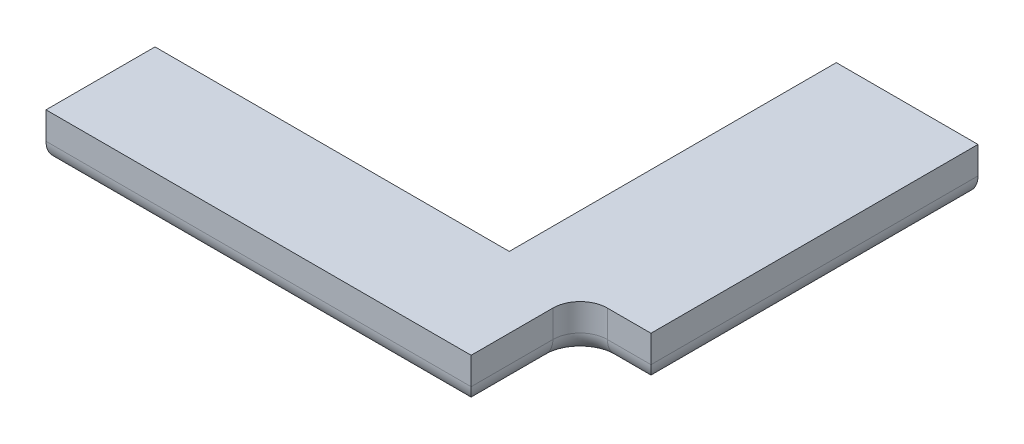
ISO-10303-21;
HEADER;
FILE_DESCRIPTION(('STEP AP214'),'2;1');
FILE_NAME('part.step','',(''),(''),'','','');
FILE_SCHEMA(('AUTOMOTIVE_DESIGN { 1 0 10303 214 1 1 1 1 }'));
ENDSEC;
DATA;
#1=APPLICATION_CONTEXT('core data for automotive mechanical design processes');
#2=APPLICATION_PROTOCOL_DEFINITION('international standard','automotive_design',2000,#1);
#3=PRODUCT_CONTEXT('',#1,'mechanical');
#4=PRODUCT('Part','Part','',(#3));
#5=PRODUCT_RELATED_PRODUCT_CATEGORY('part','',(#4));
#6=PRODUCT_DEFINITION_FORMATION('','',#4);
#7=PRODUCT_DEFINITION_CONTEXT('part definition',#1,'design');
#8=PRODUCT_DEFINITION('design','',#6,#7);
#9=PRODUCT_DEFINITION_SHAPE('','',#8);
#10=(LENGTH_UNIT() NAMED_UNIT(*) SI_UNIT(.MILLI.,.METRE.));
#11=(NAMED_UNIT(*) PLANE_ANGLE_UNIT() SI_UNIT($,.RADIAN.));
#12=(NAMED_UNIT(*) SI_UNIT($,.STERADIAN.) SOLID_ANGLE_UNIT());
#13=UNCERTAINTY_MEASURE_WITH_UNIT(LENGTH_MEASURE(1.E-05),#10,'distance_accuracy_value','');
#14=(GEOMETRIC_REPRESENTATION_CONTEXT(3) GLOBAL_UNCERTAINTY_ASSIGNED_CONTEXT((#13)) GLOBAL_UNIT_ASSIGNED_CONTEXT((#10,
#11,#12)) REPRESENTATION_CONTEXT('',''));
#15=CARTESIAN_POINT('',(0.,0.,0.));
#16=DIRECTION('',(0.,0.,1.));
#17=DIRECTION('',(1.,0.,0.));
#18=AXIS2_PLACEMENT_3D('',#15,#16,#17);
#19=CARTESIAN_POINT('',(0.,9.,20.));
#20=DIRECTION('',(1.,0.,0.));
#21=DIRECTION('',(0.,0.,-1.));
#22=AXIS2_PLACEMENT_3D('',#19,#20,#21);
#23=PLANE('',#22);
#24=DIRECTION('',(0.,0.,1.));
#25=VECTOR('',#24,1.);
#26=CARTESIAN_POINT('',(0.,0.,20.));
#27=LINE('',#26,#25);
#28=CARTESIAN_POINT('',(0.,0.,0.));
#29=VERTEX_POINT('',#28);
#30=CARTESIAN_POINT('',(0.,0.,16.));
#31=VERTEX_POINT('',#30);
#32=EDGE_CURVE('E178',#29,#31,#27,.T.);
#33=ORIENTED_EDGE('',*,*,#32,.T.);
#34=CARTESIAN_POINT('',(0.,4.,16.));
#35=DIRECTION('',(1.,0.,0.));
#36=DIRECTION('',(0.,0.,-1.));
#37=AXIS2_PLACEMENT_3D('',#34,#35,#36);
#38=CIRCLE('',#37,4.);
#39=CARTESIAN_POINT('',(0.,4.,20.));
#40=VERTEX_POINT('',#39);
#41=EDGE_CURVE('E11',#31,#40,#38,.F.);
#42=ORIENTED_EDGE('',*,*,#41,.T.);
#43=DIRECTION('',(0.,-1.,0.));
#44=VECTOR('',#43,1.);
#45=CARTESIAN_POINT('',(0.,9.,20.));
#46=LINE('',#45,#44);
#47=CARTESIAN_POINT('',(0.,9.,20.));
#48=VERTEX_POINT('',#47);
#49=EDGE_CURVE('E124',#48,#40,#46,.T.);
#50=ORIENTED_EDGE('',*,*,#49,.F.);
#51=DIRECTION('',(0.,0.,1.));
#52=VECTOR('',#51,1.);
#53=CARTESIAN_POINT('',(0.,9.,20.));
#54=LINE('',#53,#52);
#55=CARTESIAN_POINT('',(0.,9.,0.));
#56=VERTEX_POINT('',#55);
#57=EDGE_CURVE('E129',#56,#48,#54,.T.);
#58=ORIENTED_EDGE('',*,*,#57,.F.);
#59=DIRECTION('',(0.,-1.,0.));
#60=VECTOR('',#59,1.);
#61=CARTESIAN_POINT('',(0.,9.,0.));
#62=LINE('',#61,#60);
#63=EDGE_CURVE('E193',#56,#29,#62,.T.);
#64=ORIENTED_EDGE('',*,*,#63,.T.);
#65=EDGE_LOOP('',(#33,#42,#50,#58,#64));
#66=FACE_BOUND('',#65,.T.);
#67=ADVANCED_FACE('F33',(#66),#23,.F.);
#68=CARTESIAN_POINT('',(78.,9.,20.));
#69=DIRECTION('',(0.,0.,-1.));
#70=DIRECTION('',(-1.,0.,0.));
#71=AXIS2_PLACEMENT_3D('',#68,#69,#70);
#72=PLANE('',#71);
#73=ORIENTED_EDGE('',*,*,#49,.T.);
#74=DIRECTION('',(1.,0.,0.));
#75=VECTOR('',#74,1.);
#76=CARTESIAN_POINT('',(78.,4.,20.));
#77=LINE('',#76,#75);
#78=CARTESIAN_POINT('',(78.,4.,20.));
#79=VERTEX_POINT('',#78);
#80=EDGE_CURVE('E42',#40,#79,#77,.T.);
#81=ORIENTED_EDGE('',*,*,#80,.T.);
#82=DIRECTION('',(0.,-1.,0.));
#83=VECTOR('',#82,1.);
#84=CARTESIAN_POINT('',(78.,9.,20.));
#85=LINE('',#84,#83);
#86=CARTESIAN_POINT('',(78.,9.,20.));
#87=VERTEX_POINT('',#86);
#88=EDGE_CURVE('E125',#87,#79,#85,.T.);
#89=ORIENTED_EDGE('',*,*,#88,.F.);
#90=DIRECTION('',(1.,0.,0.));
#91=VECTOR('',#90,1.);
#92=CARTESIAN_POINT('',(78.,9.,20.));
#93=LINE('',#92,#91);
#94=EDGE_CURVE('E121',#48,#87,#93,.T.);
#95=ORIENTED_EDGE('',*,*,#94,.F.);
#96=EDGE_LOOP('',(#73,#81,#89,#95));
#97=FACE_BOUND('',#96,.T.);
#98=ADVANCED_FACE('F123',(#97),#72,.F.);
#99=CARTESIAN_POINT('',(78.,9.,5.));
#100=DIRECTION('',(-1.,0.,0.));
#101=DIRECTION('',(0.,0.,1.));
#102=AXIS2_PLACEMENT_3D('',#99,#100,#101);
#103=PLANE('',#102);
#104=ORIENTED_EDGE('',*,*,#88,.T.);
#105=DIRECTION('',(0.,0.,-1.));
#106=VECTOR('',#105,1.);
#107=CARTESIAN_POINT('',(78.,4.,5.));
#108=LINE('',#107,#106);
#109=CARTESIAN_POINT('',(78.,4.,5.));
#110=VERTEX_POINT('',#109);
#111=EDGE_CURVE('E163',#79,#110,#108,.T.);
#112=ORIENTED_EDGE('',*,*,#111,.T.);
#113=DIRECTION('',(0.,-1.,0.));
#114=VECTOR('',#113,1.);
#115=CARTESIAN_POINT('',(78.,9.,5.));
#116=LINE('',#115,#114);
#117=CARTESIAN_POINT('',(78.,9.,5.));
#118=VERTEX_POINT('',#117);
#119=EDGE_CURVE('E144',#118,#110,#116,.T.);
#120=ORIENTED_EDGE('',*,*,#119,.F.);
#121=DIRECTION('',(0.,0.,-1.));
#122=VECTOR('',#121,1.);
#123=CARTESIAN_POINT('',(78.,9.,5.));
#124=LINE('',#123,#122);
#125=EDGE_CURVE('E128',#87,#118,#124,.T.);
#126=ORIENTED_EDGE('',*,*,#125,.F.);
#127=EDGE_LOOP('',(#104,#112,#120,#126));
#128=FACE_BOUND('',#127,.T.);
#129=ADVANCED_FACE('F269',(#128),#103,.F.);
#130=CARTESIAN_POINT('',(83.,9.,5.));
#131=DIRECTION('',(0.,-1.,0.));
#132=DIRECTION('',(0.,0.,-1.));
#133=AXIS2_PLACEMENT_3D('',#130,#131,#132);
#134=CYLINDRICAL_SURFACE('',#133,5.00000000000001);
#135=ORIENTED_EDGE('',*,*,#119,.T.);
#136=CARTESIAN_POINT('',(83.,4.,5.));
#137=DIRECTION('',(0.,1.,0.));
#138=DIRECTION('',(0.,0.,1.));
#139=AXIS2_PLACEMENT_3D('',#136,#137,#138);
#140=CIRCLE('',#139,5.00000000000001);
#141=CARTESIAN_POINT('',(83.,4.,0.));
#142=VERTEX_POINT('',#141);
#143=EDGE_CURVE('E157',#110,#142,#140,.F.);
#144=ORIENTED_EDGE('',*,*,#143,.T.);
#145=DIRECTION('',(0.,-1.,0.));
#146=VECTOR('',#145,1.);
#147=CARTESIAN_POINT('',(83.,9.,0.));
#148=LINE('',#147,#146);
#149=CARTESIAN_POINT('',(83.,9.,0.));
#150=VERTEX_POINT('',#149);
#151=EDGE_CURVE('E207',#150,#142,#148,.T.);
#152=ORIENTED_EDGE('',*,*,#151,.F.);
#153=CARTESIAN_POINT('',(83.,9.,5.));
#154=DIRECTION('',(0.,-1.,0.));
#155=DIRECTION('',(0.,0.,1.));
#156=AXIS2_PLACEMENT_3D('',#153,#154,#155);
#157=CIRCLE('',#156,5.00000000000001);
#158=EDGE_CURVE('E215',#118,#150,#157,.T.);
#159=ORIENTED_EDGE('',*,*,#158,.F.);
#160=EDGE_LOOP('',(#135,#144,#152,#159));
#161=FACE_BOUND('',#160,.T.);
#162=ADVANCED_FACE('F213',(#161),#134,.F.);
#163=CARTESIAN_POINT('',(91.,9.,0.));
#164=DIRECTION('',(0.,0.,-1.));
#165=DIRECTION('',(-1.,0.,0.));
#166=AXIS2_PLACEMENT_3D('',#163,#164,#165);
#167=PLANE('',#166);
#168=ORIENTED_EDGE('',*,*,#151,.T.);
#169=DIRECTION('',(1.,0.,0.));
#170=VECTOR('',#169,1.);
#171=CARTESIAN_POINT('',(91.,4.,0.));
#172=LINE('',#171,#170);
#173=CARTESIAN_POINT('',(91.,4.,0.));
#174=VERTEX_POINT('',#173);
#175=EDGE_CURVE('E139',#142,#174,#172,.T.);
#176=ORIENTED_EDGE('',*,*,#175,.T.);
#177=DIRECTION('',(0.,-1.,0.));
#178=VECTOR('',#177,1.);
#179=CARTESIAN_POINT('',(91.,9.,0.));
#180=LINE('',#179,#178);
#181=CARTESIAN_POINT('',(91.,9.,0.));
#182=VERTEX_POINT('',#181);
#183=EDGE_CURVE('E204',#182,#174,#180,.T.);
#184=ORIENTED_EDGE('',*,*,#183,.F.);
#185=DIRECTION('',(1.,0.,0.));
#186=VECTOR('',#185,1.);
#187=CARTESIAN_POINT('',(91.,9.,0.));
#188=LINE('',#187,#186);
#189=EDGE_CURVE('E237',#150,#182,#188,.T.);
#190=ORIENTED_EDGE('',*,*,#189,.F.);
#191=EDGE_LOOP('',(#168,#176,#184,#190));
#192=FACE_BOUND('',#191,.T.);
#193=ADVANCED_FACE('F228',(#192),#167,.F.);
#194=CARTESIAN_POINT('',(91.,9.,-60.));
#195=DIRECTION('',(-1.,0.,0.));
#196=DIRECTION('',(0.,0.,1.));
#197=AXIS2_PLACEMENT_3D('',#194,#195,#196);
#198=PLANE('',#197);
#199=ORIENTED_EDGE('',*,*,#183,.T.);
#200=DIRECTION('',(0.,0.,-1.));
#201=VECTOR('',#200,1.);
#202=CARTESIAN_POINT('',(91.,4.,-60.));
#203=LINE('',#202,#201);
#204=CARTESIAN_POINT('',(91.,4.,-60.));
#205=VERTEX_POINT('',#204);
#206=EDGE_CURVE('E159',#174,#205,#203,.T.);
#207=ORIENTED_EDGE('',*,*,#206,.T.);
#208=DIRECTION('',(0.,-1.,0.));
#209=VECTOR('',#208,1.);
#210=CARTESIAN_POINT('',(91.,9.,-60.));
#211=LINE('',#210,#209);
#212=CARTESIAN_POINT('',(91.,9.,-60.));
#213=VERTEX_POINT('',#212);
#214=EDGE_CURVE('E201',#213,#205,#211,.T.);
#215=ORIENTED_EDGE('',*,*,#214,.F.);
#216=DIRECTION('',(0.,0.,-1.));
#217=VECTOR('',#216,1.);
#218=CARTESIAN_POINT('',(91.,9.,-60.));
#219=LINE('',#218,#217);
#220=EDGE_CURVE('E234',#182,#213,#219,.T.);
#221=ORIENTED_EDGE('',*,*,#220,.F.);
#222=EDGE_LOOP('',(#199,#207,#215,#221));
#223=FACE_BOUND('',#222,.T.);
#224=ADVANCED_FACE('F232',(#223),#198,.F.);
#225=CARTESIAN_POINT('',(65.,9.,-60.));
#226=DIRECTION('',(0.,0.,1.));
#227=DIRECTION('',(1.,0.,0.));
#228=AXIS2_PLACEMENT_3D('',#225,#226,#227);
#229=PLANE('',#228);
#230=ORIENTED_EDGE('',*,*,#214,.T.);
#231=CARTESIAN_POINT('',(87.,4.,-60.));
#232=DIRECTION('',(0.,0.,1.));
#233=DIRECTION('',(1.,0.,0.));
#234=AXIS2_PLACEMENT_3D('',#231,#232,#233);
#235=CIRCLE('',#234,4.);
#236=CARTESIAN_POINT('',(87.,0.,-60.));
#237=VERTEX_POINT('',#236);
#238=EDGE_CURVE('E161',#205,#237,#235,.F.);
#239=ORIENTED_EDGE('',*,*,#238,.T.);
#240=DIRECTION('',(-1.,0.,0.));
#241=VECTOR('',#240,1.);
#242=CARTESIAN_POINT('',(65.,0.,-60.));
#243=LINE('',#242,#241);
#244=CARTESIAN_POINT('',(65.,0.,-60.));
#245=VERTEX_POINT('',#244);
#246=EDGE_CURVE('E183',#237,#245,#243,.T.);
#247=ORIENTED_EDGE('',*,*,#246,.T.);
#248=DIRECTION('',(0.,-1.,0.));
#249=VECTOR('',#248,1.);
#250=CARTESIAN_POINT('',(65.,9.,-60.));
#251=LINE('',#250,#249);
#252=CARTESIAN_POINT('',(65.,9.,-60.));
#253=VERTEX_POINT('',#252);
#254=EDGE_CURVE('E198',#253,#245,#251,.T.);
#255=ORIENTED_EDGE('',*,*,#254,.F.);
#256=DIRECTION('',(-1.,0.,0.));
#257=VECTOR('',#256,1.);
#258=CARTESIAN_POINT('',(65.,9.,-60.));
#259=LINE('',#258,#257);
#260=EDGE_CURVE('E236',#213,#253,#259,.T.);
#261=ORIENTED_EDGE('',*,*,#260,.F.);
#262=EDGE_LOOP('',(#230,#239,#247,#255,#261));
#263=FACE_BOUND('',#262,.T.);
#264=ADVANCED_FACE('F374',(#263),#229,.F.);
#265=CARTESIAN_POINT('',(65.,9.,0.));
#266=DIRECTION('',(1.,0.,0.));
#267=DIRECTION('',(0.,0.,-1.));
#268=AXIS2_PLACEMENT_3D('',#265,#266,#267);
#269=PLANE('',#268);
#270=DIRECTION('',(0.,0.,1.));
#271=VECTOR('',#270,1.);
#272=CARTESIAN_POINT('',(65.,0.,0.));
#273=LINE('',#272,#271);
#274=CARTESIAN_POINT('',(65.,0.,0.));
#275=VERTEX_POINT('',#274);
#276=EDGE_CURVE('E186',#245,#275,#273,.T.);
#277=ORIENTED_EDGE('',*,*,#276,.T.);
#278=DIRECTION('',(0.,-1.,0.));
#279=VECTOR('',#278,1.);
#280=CARTESIAN_POINT('',(65.,9.,0.));
#281=LINE('',#280,#279);
#282=CARTESIAN_POINT('',(65.,9.,0.));
#283=VERTEX_POINT('',#282);
#284=EDGE_CURVE('E195',#283,#275,#281,.T.);
#285=ORIENTED_EDGE('',*,*,#284,.F.);
#286=DIRECTION('',(0.,0.,1.));
#287=VECTOR('',#286,1.);
#288=CARTESIAN_POINT('',(65.,9.,0.));
#289=LINE('',#288,#287);
#290=EDGE_CURVE('E239',#253,#283,#289,.T.);
#291=ORIENTED_EDGE('',*,*,#290,.F.);
#292=ORIENTED_EDGE('',*,*,#254,.T.);
#293=EDGE_LOOP('',(#277,#285,#291,#292));
#294=FACE_BOUND('',#293,.T.);
#295=ADVANCED_FACE('F247',(#294),#269,.F.);
#296=CARTESIAN_POINT('',(0.,9.,0.));
#297=DIRECTION('',(0.,0.,1.));
#298=DIRECTION('',(1.,0.,0.));
#299=AXIS2_PLACEMENT_3D('',#296,#297,#298);
#300=PLANE('',#299);
#301=DIRECTION('',(-1.,0.,0.));
#302=VECTOR('',#301,1.);
#303=CARTESIAN_POINT('',(0.,0.,0.));
#304=LINE('',#303,#302);
#305=EDGE_CURVE('E137',#275,#29,#304,.T.);
#306=ORIENTED_EDGE('',*,*,#305,.T.);
#307=ORIENTED_EDGE('',*,*,#63,.F.);
#308=DIRECTION('',(-1.,0.,0.));
#309=VECTOR('',#308,1.);
#310=CARTESIAN_POINT('',(0.,9.,0.));
#311=LINE('',#310,#309);
#312=EDGE_CURVE('E134',#283,#56,#311,.T.);
#313=ORIENTED_EDGE('',*,*,#312,.F.);
#314=ORIENTED_EDGE('',*,*,#284,.T.);
#315=EDGE_LOOP('',(#306,#307,#313,#314));
#316=FACE_BOUND('',#315,.T.);
#317=ADVANCED_FACE('F251',(#316),#300,.F.);
#318=CARTESIAN_POINT('',(83.,9.,5.));
#319=DIRECTION('',(0.,1.,0.));
#320=DIRECTION('',(0.,0.,1.));
#321=AXIS2_PLACEMENT_3D('',#318,#319,#320);
#322=PLANE('',#321);
#323=ORIENTED_EDGE('',*,*,#57,.T.);
#324=ORIENTED_EDGE('',*,*,#94,.T.);
#325=ORIENTED_EDGE('',*,*,#125,.T.);
#326=ORIENTED_EDGE('',*,*,#158,.T.);
#327=ORIENTED_EDGE('',*,*,#189,.T.);
#328=ORIENTED_EDGE('',*,*,#220,.T.);
#329=ORIENTED_EDGE('',*,*,#260,.T.);
#330=ORIENTED_EDGE('',*,*,#290,.T.);
#331=ORIENTED_EDGE('',*,*,#312,.T.);
#332=EDGE_LOOP('',(#323,#324,#325,#326,#327,#328,#329,#330,#331));
#333=FACE_BOUND('',#332,.T.);
#334=ADVANCED_FACE('F132',(#333),#322,.T.);
#335=CARTESIAN_POINT('',(83.,0.,5.));
#336=DIRECTION('',(0.,1.,0.));
#337=DIRECTION('',(0.,0.,1.));
#338=AXIS2_PLACEMENT_3D('',#335,#336,#337);
#339=PLANE('',#338);
#340=CARTESIAN_POINT('',(77.,0.,-30.));
#341=DIRECTION('',(0.,-1.,0.));
#342=DIRECTION('',(0.,0.,-1.));
#343=AXIS2_PLACEMENT_3D('',#340,#341,#342);
#344=CIRCLE('',#343,6.);
#345=CARTESIAN_POINT('',(77.,0.,-36.));
#346=VERTEX_POINT('',#345);
#347=EDGE_CURVE('E437',#346,#346,#344,.T.);
#348=ORIENTED_EDGE('',*,*,#347,.F.);
#349=EDGE_LOOP('',(#348));
#350=FACE_BOUND('',#349,.T.);
#351=CARTESIAN_POINT('',(77.,0.,-50.));
#352=DIRECTION('',(0.,-1.,0.));
#353=DIRECTION('',(0.,0.,-1.));
#354=AXIS2_PLACEMENT_3D('',#351,#352,#353);
#355=CIRCLE('',#354,6.);
#356=CARTESIAN_POINT('',(77.,0.,-56.));
#357=VERTEX_POINT('',#356);
#358=EDGE_CURVE('E431',#357,#357,#355,.T.);
#359=ORIENTED_EDGE('',*,*,#358,.F.);
#360=EDGE_LOOP('',(#359));
#361=FACE_BOUND('',#360,.T.);
#362=ORIENTED_EDGE('',*,*,#246,.F.);
#363=DIRECTION('',(0.,0.,-1.));
#364=VECTOR('',#363,1.);
#365=CARTESIAN_POINT('',(87.,0.,5.));
#366=LINE('',#365,#364);
#367=CARTESIAN_POINT('',(87.,0.,-4.));
#368=VERTEX_POINT('',#367);
#369=EDGE_CURVE('E155',#237,#368,#366,.F.);
#370=ORIENTED_EDGE('',*,*,#369,.T.);
#371=DIRECTION('',(1.,0.,0.));
#372=VECTOR('',#371,1.);
#373=CARTESIAN_POINT('',(83.,0.,-4.));
#374=LINE('',#373,#372);
#375=CARTESIAN_POINT('',(83.,0.,-4.00000000000001));
#376=VERTEX_POINT('',#375);
#377=EDGE_CURVE('E153',#368,#376,#374,.F.);
#378=ORIENTED_EDGE('',*,*,#377,.T.);
#379=CARTESIAN_POINT('',(83.,0.,5.));
#380=DIRECTION('',(0.,1.,0.));
#381=DIRECTION('',(0.,0.,1.));
#382=AXIS2_PLACEMENT_3D('',#379,#380,#381);
#383=CIRCLE('',#382,9.00000000000001);
#384=CARTESIAN_POINT('',(74.,0.,5.));
#385=VERTEX_POINT('',#384);
#386=EDGE_CURVE('E151',#376,#385,#383,.T.);
#387=ORIENTED_EDGE('',*,*,#386,.T.);
#388=DIRECTION('',(0.,0.,-1.));
#389=VECTOR('',#388,1.);
#390=CARTESIAN_POINT('',(74.,0.,5.00000000000001));
#391=LINE('',#390,#389);
#392=CARTESIAN_POINT('',(74.,0.,16.));
#393=VERTEX_POINT('',#392);
#394=EDGE_CURVE('E149',#385,#393,#391,.F.);
#395=ORIENTED_EDGE('',*,*,#394,.T.);
#396=DIRECTION('',(1.,0.,0.));
#397=VECTOR('',#396,1.);
#398=CARTESIAN_POINT('',(83.,0.,16.));
#399=LINE('',#398,#397);
#400=EDGE_CURVE('E142',#393,#31,#399,.F.);
#401=ORIENTED_EDGE('',*,*,#400,.T.);
#402=ORIENTED_EDGE('',*,*,#32,.F.);
#403=ORIENTED_EDGE('',*,*,#305,.F.);
#404=ORIENTED_EDGE('',*,*,#276,.F.);
#405=EDGE_LOOP('',(#362,#370,#378,#387,#395,#401,#402,#403,#404));
#406=FACE_BOUND('',#405,.T.);
#407=ADVANCED_FACE('F254',(#350,#361,#406),#339,.F.);
#408=CARTESIAN_POINT('',(78.,4.,16.));
#409=DIRECTION('',(1.,0.,0.));
#410=DIRECTION('',(0.,0.,-1.));
#411=AXIS2_PLACEMENT_3D('',#408,#409,#410);
#412=CYLINDRICAL_SURFACE('',#411,4.);
#413=ORIENTED_EDGE('',*,*,#41,.F.);
#414=ORIENTED_EDGE('',*,*,#400,.F.);
#415=CARTESIAN_POINT('',(74.,4.,16.));
#416=DIRECTION('',(0.707106781186547,0.,-0.707106781186548));
#417=DIRECTION('',(0.707106781186548,0.,0.707106781186547));
#418=AXIS2_PLACEMENT_3D('',#415,#416,#417);
#419=ELLIPSE('',#418,5.65685424949238,4.);
#420=EDGE_CURVE('E37',#79,#393,#419,.T.);
#421=ORIENTED_EDGE('',*,*,#420,.F.);
#422=ORIENTED_EDGE('',*,*,#80,.F.);
#423=EDGE_LOOP('',(#413,#414,#421,#422));
#424=FACE_BOUND('',#423,.T.);
#425=ADVANCED_FACE('F35',(#424),#412,.T.);
#426=CARTESIAN_POINT('',(74.,4.,5.));
#427=DIRECTION('',(0.,0.,-1.));
#428=DIRECTION('',(-1.,0.,0.));
#429=AXIS2_PLACEMENT_3D('',#426,#427,#428);
#430=CYLINDRICAL_SURFACE('',#429,4.);
#431=ORIENTED_EDGE('',*,*,#420,.T.);
#432=ORIENTED_EDGE('',*,*,#394,.F.);
#433=CARTESIAN_POINT('',(74.,4.,5.));
#434=DIRECTION('',(0.,0.,-1.));
#435=DIRECTION('',(0.,1.,0.));
#436=AXIS2_PLACEMENT_3D('',#433,#434,#435);
#437=CIRCLE('',#436,4.);
#438=EDGE_CURVE('E171',#110,#385,#437,.T.);
#439=ORIENTED_EDGE('',*,*,#438,.F.);
#440=ORIENTED_EDGE('',*,*,#111,.F.);
#441=EDGE_LOOP('',(#431,#432,#439,#440));
#442=FACE_BOUND('',#441,.T.);
#443=ADVANCED_FACE('F217',(#442),#430,.T.);
#444=CARTESIAN_POINT('',(83.,4.,5.));
#445=DIRECTION('',(0.,1.,0.));
#446=DIRECTION('',(0.,0.,1.));
#447=AXIS2_PLACEMENT_3D('',#444,#445,#446);
#448=TOROIDAL_SURFACE('',#447,9.00000000000001,4.);
#449=ORIENTED_EDGE('',*,*,#438,.T.);
#450=ORIENTED_EDGE('',*,*,#386,.F.);
#451=CARTESIAN_POINT('',(83.,4.,-4.00000000000001));
#452=DIRECTION('',(1.,0.,0.));
#453=DIRECTION('',(0.,0.,-1.));
#454=AXIS2_PLACEMENT_3D('',#451,#452,#453);
#455=CIRCLE('',#454,4.);
#456=EDGE_CURVE('E168',#142,#376,#455,.T.);
#457=ORIENTED_EDGE('',*,*,#456,.F.);
#458=ORIENTED_EDGE('',*,*,#143,.F.);
#459=EDGE_LOOP('',(#449,#450,#457,#458));
#460=FACE_BOUND('',#459,.T.);
#461=ADVANCED_FACE('F219',(#460),#448,.T.);
#462=CARTESIAN_POINT('',(87.,4.,-60.));
#463=DIRECTION('',(0.,0.,-1.));
#464=DIRECTION('',(-1.,0.,0.));
#465=AXIS2_PLACEMENT_3D('',#462,#463,#464);
#466=CYLINDRICAL_SURFACE('',#465,4.);
#467=ORIENTED_EDGE('',*,*,#238,.F.);
#468=ORIENTED_EDGE('',*,*,#206,.F.);
#469=CARTESIAN_POINT('',(87.,4.,-4.));
#470=DIRECTION('',(0.707106781186547,0.,-0.707106781186548));
#471=DIRECTION('',(-0.707106781186548,0.,-0.707106781186547));
#472=AXIS2_PLACEMENT_3D('',#469,#470,#471);
#473=ELLIPSE('',#472,5.65685424949238,4.);
#474=EDGE_CURVE('E166',#368,#174,#473,.F.);
#475=ORIENTED_EDGE('',*,*,#474,.F.);
#476=ORIENTED_EDGE('',*,*,#369,.F.);
#477=EDGE_LOOP('',(#467,#468,#475,#476));
#478=FACE_BOUND('',#477,.T.);
#479=ADVANCED_FACE('F276',(#478),#466,.T.);
#480=CARTESIAN_POINT('',(91.,4.,-4.));
#481=DIRECTION('',(1.,0.,0.));
#482=DIRECTION('',(0.,0.,-1.));
#483=AXIS2_PLACEMENT_3D('',#480,#481,#482);
#484=CYLINDRICAL_SURFACE('',#483,4.);
#485=ORIENTED_EDGE('',*,*,#456,.T.);
#486=ORIENTED_EDGE('',*,*,#377,.F.);
#487=ORIENTED_EDGE('',*,*,#474,.T.);
#488=ORIENTED_EDGE('',*,*,#175,.F.);
#489=EDGE_LOOP('',(#485,#486,#487,#488));
#490=FACE_BOUND('',#489,.T.);
#491=ADVANCED_FACE('F223',(#490),#484,.T.);
#492=CARTESIAN_POINT('',(77.,3.,-50.));
#493=DIRECTION('',(0.,-1.,0.));
#494=DIRECTION('',(0.,0.,-1.));
#495=AXIS2_PLACEMENT_3D('',#492,#493,#494);
#496=CYLINDRICAL_SURFACE('',#495,6.);
#497=CARTESIAN_POINT('',(77.,3.,-50.));
#498=DIRECTION('',(0.,-1.,0.));
#499=DIRECTION('',(0.,0.,-1.));
#500=AXIS2_PLACEMENT_3D('',#497,#498,#499);
#501=CIRCLE('',#500,6.);
#502=CARTESIAN_POINT('',(77.,3.,-56.));
#503=VERTEX_POINT('',#502);
#504=EDGE_CURVE('E434',#503,#503,#501,.T.);
#505=ORIENTED_EDGE('',*,*,#504,.F.);
#506=EDGE_LOOP('',(#505));
#507=FACE_BOUND('',#506,.T.);
#508=ORIENTED_EDGE('',*,*,#358,.T.);
#509=EDGE_LOOP('',(#508));
#510=FACE_BOUND('',#509,.T.);
#511=ADVANCED_FACE('F275',(#507,#510),#496,.F.);
#512=CARTESIAN_POINT('',(77.,3.,-50.));
#513=DIRECTION('',(0.,-1.,0.));
#514=DIRECTION('',(0.,0.,-1.));
#515=AXIS2_PLACEMENT_3D('',#512,#513,#514);
#516=PLANE('',#515);
#517=ORIENTED_EDGE('',*,*,#504,.T.);
#518=EDGE_LOOP('',(#517));
#519=FACE_BOUND('',#518,.T.);
#520=ADVANCED_FACE('F300',(#519),#516,.T.);
#521=CARTESIAN_POINT('',(77.,3.,-30.));
#522=DIRECTION('',(0.,-1.,0.));
#523=DIRECTION('',(0.,0.,-1.));
#524=AXIS2_PLACEMENT_3D('',#521,#522,#523);
#525=CYLINDRICAL_SURFACE('',#524,6.);
#526=CARTESIAN_POINT('',(77.,3.,-30.));
#527=DIRECTION('',(0.,-1.,0.));
#528=DIRECTION('',(0.,0.,-1.));
#529=AXIS2_PLACEMENT_3D('',#526,#527,#528);
#530=CIRCLE('',#529,6.);
#531=CARTESIAN_POINT('',(77.,3.,-36.));
#532=VERTEX_POINT('',#531);
#533=EDGE_CURVE('E169',#532,#532,#530,.T.);
#534=ORIENTED_EDGE('',*,*,#533,.F.);
#535=EDGE_LOOP('',(#534));
#536=FACE_BOUND('',#535,.T.);
#537=ORIENTED_EDGE('',*,*,#347,.T.);
#538=EDGE_LOOP('',(#537));
#539=FACE_BOUND('',#538,.T.);
#540=ADVANCED_FACE('F308',(#536,#539),#525,.F.);
#541=CARTESIAN_POINT('',(77.,3.,-30.));
#542=DIRECTION('',(0.,-1.,0.));
#543=DIRECTION('',(0.,0.,-1.));
#544=AXIS2_PLACEMENT_3D('',#541,#542,#543);
#545=PLANE('',#544);
#546=ORIENTED_EDGE('',*,*,#533,.T.);
#547=EDGE_LOOP('',(#546));
#548=FACE_BOUND('',#547,.T.);
#549=ADVANCED_FACE('F316',(#548),#545,.T.);
#550=CLOSED_SHELL('',(#67,#98,#129,#162,#193,#224,#264,#295,#317,#334,#407,#425,#443,#461,#479,
#491,#511,#520,#540,#549));
#551=MANIFOLD_SOLID_BREP('B2',#550);
#552=ADVANCED_BREP_SHAPE_REPRESENTATION('',(#18,#551),#14);
#553=SHAPE_DEFINITION_REPRESENTATION(#9,#552);
ENDSEC;
END-ISO-10303-21;
